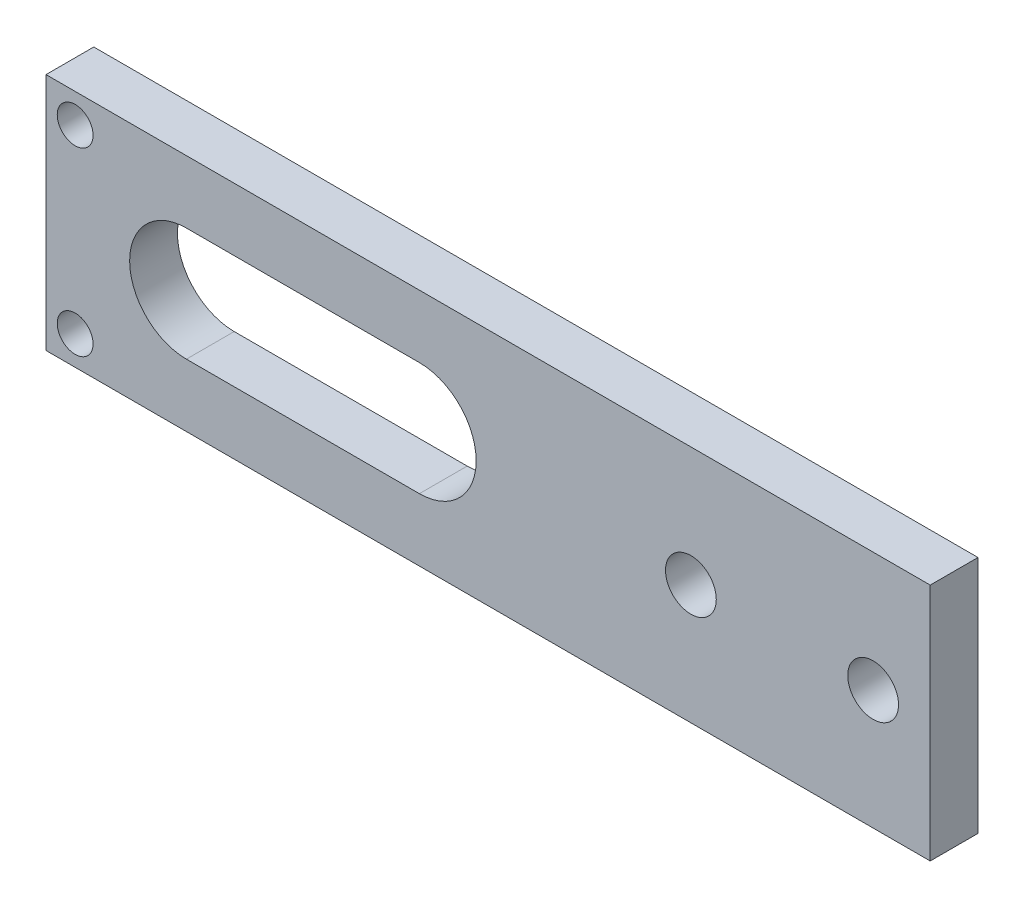
ISO-10303-21;
HEADER;
FILE_DESCRIPTION(('STEP AP214'),'2;1');
FILE_NAME('part.step','',(''),(''),'','','');
FILE_SCHEMA(('AUTOMOTIVE_DESIGN { 1 0 10303 214 1 1 1 1 }'));
ENDSEC;
DATA;
#1=APPLICATION_CONTEXT('core data for automotive mechanical design processes');
#2=APPLICATION_PROTOCOL_DEFINITION('international standard','automotive_design',2000,#1);
#3=PRODUCT_CONTEXT('',#1,'mechanical');
#4=PRODUCT('Part','Part','',(#3));
#5=PRODUCT_RELATED_PRODUCT_CATEGORY('part','',(#4));
#6=PRODUCT_DEFINITION_FORMATION('','',#4);
#7=PRODUCT_DEFINITION_CONTEXT('part definition',#1,'design');
#8=PRODUCT_DEFINITION('design','',#6,#7);
#9=PRODUCT_DEFINITION_SHAPE('','',#8);
#10=(LENGTH_UNIT() NAMED_UNIT(*) SI_UNIT(.MILLI.,.METRE.));
#11=(NAMED_UNIT(*) PLANE_ANGLE_UNIT() SI_UNIT($,.RADIAN.));
#12=(NAMED_UNIT(*) SI_UNIT($,.STERADIAN.) SOLID_ANGLE_UNIT());
#13=UNCERTAINTY_MEASURE_WITH_UNIT(LENGTH_MEASURE(1.E-05),#10,'distance_accuracy_value','');
#14=(GEOMETRIC_REPRESENTATION_CONTEXT(3) GLOBAL_UNCERTAINTY_ASSIGNED_CONTEXT((#13)) GLOBAL_UNIT_ASSIGNED_CONTEXT((#10,
#11,#12)) REPRESENTATION_CONTEXT('',''));
#15=CARTESIAN_POINT('',(0.,0.,0.));
#16=DIRECTION('',(0.,0.,1.));
#17=DIRECTION('',(1.,0.,0.));
#18=AXIS2_PLACEMENT_3D('',#15,#16,#17);
#19=CARTESIAN_POINT('',(0.,0.,4.));
#20=DIRECTION('',(0.,0.,1.));
#21=DIRECTION('',(1.,0.,0.));
#22=AXIS2_PLACEMENT_3D('',#19,#20,#21);
#23=PLANE('',#22);
#24=CARTESIAN_POINT('',(-34.5593059383902,-7.55930593839024,4.));
#25=DIRECTION('',(0.,0.,1.));
#26=DIRECTION('',(1.,0.,0.));
#27=AXIS2_PLACEMENT_3D('',#24,#25,#26);
#28=CIRCLE('',#27,1.5);
#29=CARTESIAN_POINT('',(-33.0593059383902,-7.55930593839024,4.));
#30=VERTEX_POINT('',#29);
#31=EDGE_CURVE('E130',#30,#30,#28,.T.);
#32=ORIENTED_EDGE('',*,*,#31,.F.);
#33=EDGE_LOOP('',(#32));
#34=FACE_BOUND('',#33,.T.);
#35=CARTESIAN_POINT('',(32.2218543046358,0.,4.));
#36=DIRECTION('',(0.,0.,1.));
#37=DIRECTION('',(1.,0.,0.));
#38=AXIS2_PLACEMENT_3D('',#35,#36,#37);
#39=CIRCLE('',#38,2.125);
#40=CARTESIAN_POINT('',(34.3468543046358,0.,4.));
#41=VERTEX_POINT('',#40);
#42=EDGE_CURVE('E146',#41,#41,#39,.T.);
#43=ORIENTED_EDGE('',*,*,#42,.F.);
#44=EDGE_LOOP('',(#43));
#45=FACE_BOUND('',#44,.T.);
#46=DIRECTION('',(0.,1.,0.));
#47=VECTOR('',#46,1.);
#48=CARTESIAN_POINT('',(37.,10.,4.));
#49=LINE('',#48,#47);
#50=CARTESIAN_POINT('',(37.,-9.99999999999999,4.));
#51=VERTEX_POINT('',#50);
#52=CARTESIAN_POINT('',(37.,10.,4.));
#53=VERTEX_POINT('',#52);
#54=EDGE_CURVE('E152',#51,#53,#49,.T.);
#55=ORIENTED_EDGE('',*,*,#54,.T.);
#56=DIRECTION('',(-1.,0.,0.));
#57=VECTOR('',#56,1.);
#58=CARTESIAN_POINT('',(-37.,10.,4.));
#59=LINE('',#58,#57);
#60=CARTESIAN_POINT('',(-37.,10.,4.));
#61=VERTEX_POINT('',#60);
#62=EDGE_CURVE('E155',#53,#61,#59,.T.);
#63=ORIENTED_EDGE('',*,*,#62,.T.);
#64=DIRECTION('',(0.,-1.,0.));
#65=VECTOR('',#64,1.);
#66=CARTESIAN_POINT('',(-37.,10.,4.));
#67=LINE('',#66,#65);
#68=CARTESIAN_POINT('',(-37.,-9.99999999999999,4.));
#69=VERTEX_POINT('',#68);
#70=EDGE_CURVE('E158',#61,#69,#67,.T.);
#71=ORIENTED_EDGE('',*,*,#70,.T.);
#72=DIRECTION('',(1.,0.,0.));
#73=VECTOR('',#72,1.);
#74=CARTESIAN_POINT('',(-37.,-9.99999999999999,4.));
#75=LINE('',#74,#73);
#76=EDGE_CURVE('E160',#69,#51,#75,.T.);
#77=ORIENTED_EDGE('',*,*,#76,.T.);
#78=EDGE_LOOP('',(#55,#63,#71,#77));
#79=FACE_BOUND('',#78,.T.);
#80=CARTESIAN_POINT('',(16.9718543046358,-1.06490180834716E-13,4.));
#81=DIRECTION('',(0.,0.,1.));
#82=DIRECTION('',(1.,0.,0.));
#83=AXIS2_PLACEMENT_3D('',#80,#81,#82);
#84=CIRCLE('',#83,2.125);
#85=CARTESIAN_POINT('',(19.0968543046358,-1.06490180834716E-13,4.));
#86=VERTEX_POINT('',#85);
#87=EDGE_CURVE('E140',#86,#86,#84,.T.);
#88=ORIENTED_EDGE('',*,*,#87,.F.);
#89=EDGE_LOOP('',(#88));
#90=FACE_BOUND('',#89,.T.);
#91=DIRECTION('',(1.,0.,0.));
#92=VECTOR('',#91,1.);
#93=CARTESIAN_POINT('',(-25.25,-4.75,4.));
#94=LINE('',#93,#92);
#95=CARTESIAN_POINT('',(-25.25,-4.75,4.));
#96=VERTEX_POINT('',#95);
#97=CARTESIAN_POINT('',(-5.74999999999998,-4.75,4.));
#98=VERTEX_POINT('',#97);
#99=EDGE_CURVE('E109',#96,#98,#94,.T.);
#100=ORIENTED_EDGE('',*,*,#99,.F.);
#101=CARTESIAN_POINT('',(-25.25,0.,4.));
#102=DIRECTION('',(0.,0.,1.));
#103=DIRECTION('',(1.,0.,0.));
#104=AXIS2_PLACEMENT_3D('',#101,#102,#103);
#105=CIRCLE('',#104,4.75);
#106=CARTESIAN_POINT('',(-25.25,4.75,4.));
#107=VERTEX_POINT('',#106);
#108=EDGE_CURVE('E101',#107,#96,#105,.T.);
#109=ORIENTED_EDGE('',*,*,#108,.F.);
#110=DIRECTION('',(-1.,0.,0.));
#111=VECTOR('',#110,1.);
#112=CARTESIAN_POINT('',(-25.25,4.75,4.));
#113=LINE('',#112,#111);
#114=CARTESIAN_POINT('',(-5.74999999999998,4.75,4.));
#115=VERTEX_POINT('',#114);
#116=EDGE_CURVE('E124',#115,#107,#113,.T.);
#117=ORIENTED_EDGE('',*,*,#116,.F.);
#118=CARTESIAN_POINT('',(-5.74999999999998,0.,4.));
#119=DIRECTION('',(0.,0.,1.));
#120=DIRECTION('',(1.,0.,0.));
#121=AXIS2_PLACEMENT_3D('',#118,#119,#120);
#122=CIRCLE('',#121,4.75);
#123=EDGE_CURVE('E122',#98,#115,#122,.T.);
#124=ORIENTED_EDGE('',*,*,#123,.F.);
#125=EDGE_LOOP('',(#100,#109,#117,#124));
#126=FACE_BOUND('',#125,.T.);
#127=CARTESIAN_POINT('',(-34.5593059383902,7.55930593839024,4.));
#128=DIRECTION('',(0.,0.,1.));
#129=DIRECTION('',(-1.,0.,0.));
#130=AXIS2_PLACEMENT_3D('',#127,#128,#129);
#131=CIRCLE('',#130,1.5);
#132=CARTESIAN_POINT('',(-36.0593059383902,7.55930593839024,4.));
#133=VERTEX_POINT('',#132);
#134=EDGE_CURVE('E258',#133,#133,#131,.T.);
#135=ORIENTED_EDGE('',*,*,#134,.F.);
#136=EDGE_LOOP('',(#135));
#137=FACE_BOUND('',#136,.T.);
#138=ADVANCED_FACE('F36',(#34,#45,#79,#90,#126,#137),#23,.T.);
#139=CARTESIAN_POINT('',(0.,0.,0.));
#140=DIRECTION('',(0.,0.,1.));
#141=DIRECTION('',(1.,0.,0.));
#142=AXIS2_PLACEMENT_3D('',#139,#140,#141);
#143=PLANE('',#142);
#144=CARTESIAN_POINT('',(16.9718543046358,-1.06490180834716E-13,0.));
#145=DIRECTION('',(0.,0.,1.));
#146=DIRECTION('',(1.,0.,0.));
#147=AXIS2_PLACEMENT_3D('',#144,#145,#146);
#148=CIRCLE('',#147,2.125);
#149=CARTESIAN_POINT('',(19.0968543046358,-1.06490180834716E-13,0.));
#150=VERTEX_POINT('',#149);
#151=EDGE_CURVE('E117',#150,#150,#148,.T.);
#152=ORIENTED_EDGE('',*,*,#151,.T.);
#153=EDGE_LOOP('',(#152));
#154=FACE_BOUND('',#153,.T.);
#155=CARTESIAN_POINT('',(32.2218543046358,0.,0.));
#156=DIRECTION('',(0.,0.,1.));
#157=DIRECTION('',(1.,0.,0.));
#158=AXIS2_PLACEMENT_3D('',#155,#156,#157);
#159=CIRCLE('',#158,2.125);
#160=CARTESIAN_POINT('',(34.3468543046358,0.,0.));
#161=VERTEX_POINT('',#160);
#162=EDGE_CURVE('E143',#161,#161,#159,.T.);
#163=ORIENTED_EDGE('',*,*,#162,.T.);
#164=EDGE_LOOP('',(#163));
#165=FACE_BOUND('',#164,.T.);
#166=DIRECTION('',(0.,1.,0.));
#167=VECTOR('',#166,1.);
#168=CARTESIAN_POINT('',(37.,10.,0.));
#169=LINE('',#168,#167);
#170=CARTESIAN_POINT('',(37.,-9.99999999999999,0.));
#171=VERTEX_POINT('',#170);
#172=CARTESIAN_POINT('',(37.,10.,0.));
#173=VERTEX_POINT('',#172);
#174=EDGE_CURVE('E149',#171,#173,#169,.T.);
#175=ORIENTED_EDGE('',*,*,#174,.F.);
#176=DIRECTION('',(1.,0.,0.));
#177=VECTOR('',#176,1.);
#178=CARTESIAN_POINT('',(-37.,-9.99999999999999,0.));
#179=LINE('',#178,#177);
#180=CARTESIAN_POINT('',(-37.,-9.99999999999999,0.));
#181=VERTEX_POINT('',#180);
#182=EDGE_CURVE('E156',#181,#171,#179,.T.);
#183=ORIENTED_EDGE('',*,*,#182,.F.);
#184=DIRECTION('',(0.,-1.,0.));
#185=VECTOR('',#184,1.);
#186=CARTESIAN_POINT('',(-37.,10.,0.));
#187=LINE('',#186,#185);
#188=CARTESIAN_POINT('',(-37.,10.,0.));
#189=VERTEX_POINT('',#188);
#190=EDGE_CURVE('E167',#189,#181,#187,.T.);
#191=ORIENTED_EDGE('',*,*,#190,.F.);
#192=DIRECTION('',(-1.,0.,0.));
#193=VECTOR('',#192,1.);
#194=CARTESIAN_POINT('',(-37.,10.,0.));
#195=LINE('',#194,#193);
#196=EDGE_CURVE('E165',#173,#189,#195,.T.);
#197=ORIENTED_EDGE('',*,*,#196,.F.);
#198=EDGE_LOOP('',(#175,#183,#191,#197));
#199=FACE_BOUND('',#198,.T.);
#200=CARTESIAN_POINT('',(-25.25,0.,0.));
#201=DIRECTION('',(0.,0.,1.));
#202=DIRECTION('',(1.,0.,0.));
#203=AXIS2_PLACEMENT_3D('',#200,#201,#202);
#204=CIRCLE('',#203,4.75);
#205=CARTESIAN_POINT('',(-25.25,4.75,0.));
#206=VERTEX_POINT('',#205);
#207=CARTESIAN_POINT('',(-25.25,-4.75,0.));
#208=VERTEX_POINT('',#207);
#209=EDGE_CURVE('E59',#206,#208,#204,.T.);
#210=ORIENTED_EDGE('',*,*,#209,.T.);
#211=DIRECTION('',(1.,0.,0.));
#212=VECTOR('',#211,1.);
#213=CARTESIAN_POINT('',(-25.25,-4.75,0.));
#214=LINE('',#213,#212);
#215=CARTESIAN_POINT('',(-5.74999999999998,-4.75,0.));
#216=VERTEX_POINT('',#215);
#217=EDGE_CURVE('E116',#208,#216,#214,.T.);
#218=ORIENTED_EDGE('',*,*,#217,.T.);
#219=CARTESIAN_POINT('',(-5.74999999999998,0.,0.));
#220=DIRECTION('',(0.,0.,1.));
#221=DIRECTION('',(1.,0.,0.));
#222=AXIS2_PLACEMENT_3D('',#219,#220,#221);
#223=CIRCLE('',#222,4.75);
#224=CARTESIAN_POINT('',(-5.74999999999998,4.75,0.));
#225=VERTEX_POINT('',#224);
#226=EDGE_CURVE('E132',#216,#225,#223,.T.);
#227=ORIENTED_EDGE('',*,*,#226,.T.);
#228=DIRECTION('',(-1.,0.,0.));
#229=VECTOR('',#228,1.);
#230=CARTESIAN_POINT('',(-25.25,4.75,0.));
#231=LINE('',#230,#229);
#232=EDGE_CURVE('E110',#225,#206,#231,.T.);
#233=ORIENTED_EDGE('',*,*,#232,.T.);
#234=EDGE_LOOP('',(#210,#218,#227,#233));
#235=FACE_BOUND('',#234,.T.);
#236=CARTESIAN_POINT('',(-34.5593059383902,-7.55930593839024,0.));
#237=DIRECTION('',(0.,0.,1.));
#238=DIRECTION('',(1.,0.,0.));
#239=AXIS2_PLACEMENT_3D('',#236,#237,#238);
#240=CIRCLE('',#239,1.5);
#241=CARTESIAN_POINT('',(-33.0593059383902,-7.55930593839024,0.));
#242=VERTEX_POINT('',#241);
#243=EDGE_CURVE('E264',#242,#242,#240,.T.);
#244=ORIENTED_EDGE('',*,*,#243,.T.);
#245=EDGE_LOOP('',(#244));
#246=FACE_BOUND('',#245,.T.);
#247=CARTESIAN_POINT('',(-34.5593059383902,7.55930593839024,0.));
#248=DIRECTION('',(0.,0.,1.));
#249=DIRECTION('',(-1.,0.,0.));
#250=AXIS2_PLACEMENT_3D('',#247,#248,#249);
#251=CIRCLE('',#250,1.5);
#252=CARTESIAN_POINT('',(-36.0593059383902,7.55930593839024,0.));
#253=VERTEX_POINT('',#252);
#254=EDGE_CURVE('E261',#253,#253,#251,.T.);
#255=ORIENTED_EDGE('',*,*,#254,.T.);
#256=EDGE_LOOP('',(#255));
#257=FACE_BOUND('',#256,.T.);
#258=ADVANCED_FACE('F185',(#154,#165,#199,#235,#246,#257),#143,.F.);
#259=CARTESIAN_POINT('',(37.,10.,4.));
#260=DIRECTION('',(-1.,0.,0.));
#261=DIRECTION('',(0.,0.,1.));
#262=AXIS2_PLACEMENT_3D('',#259,#260,#261);
#263=PLANE('',#262);
#264=ORIENTED_EDGE('',*,*,#174,.T.);
#265=DIRECTION('',(0.,0.,-1.));
#266=VECTOR('',#265,1.);
#267=CARTESIAN_POINT('',(37.,10.,4.));
#268=LINE('',#267,#266);
#269=EDGE_CURVE('E11',#53,#173,#268,.T.);
#270=ORIENTED_EDGE('',*,*,#269,.F.);
#271=ORIENTED_EDGE('',*,*,#54,.F.);
#272=DIRECTION('',(0.,0.,-1.));
#273=VECTOR('',#272,1.);
#274=CARTESIAN_POINT('',(37.,-9.99999999999999,4.));
#275=LINE('',#274,#273);
#276=EDGE_CURVE('E162',#51,#171,#275,.T.);
#277=ORIENTED_EDGE('',*,*,#276,.T.);
#278=EDGE_LOOP('',(#264,#270,#271,#277));
#279=FACE_BOUND('',#278,.T.);
#280=ADVANCED_FACE('F38',(#279),#263,.F.);
#281=CARTESIAN_POINT('',(-37.,10.,4.));
#282=DIRECTION('',(0.,-1.,0.));
#283=DIRECTION('',(0.,0.,-1.));
#284=AXIS2_PLACEMENT_3D('',#281,#282,#283);
#285=PLANE('',#284);
#286=ORIENTED_EDGE('',*,*,#196,.T.);
#287=DIRECTION('',(0.,0.,-1.));
#288=VECTOR('',#287,1.);
#289=CARTESIAN_POINT('',(-37.,10.,4.));
#290=LINE('',#289,#288);
#291=EDGE_CURVE('E44',#61,#189,#290,.T.);
#292=ORIENTED_EDGE('',*,*,#291,.F.);
#293=ORIENTED_EDGE('',*,*,#62,.F.);
#294=ORIENTED_EDGE('',*,*,#269,.T.);
#295=EDGE_LOOP('',(#286,#292,#293,#294));
#296=FACE_BOUND('',#295,.T.);
#297=ADVANCED_FACE('F196',(#296),#285,.F.);
#298=CARTESIAN_POINT('',(-37.,10.,4.));
#299=DIRECTION('',(1.,0.,0.));
#300=DIRECTION('',(0.,1.,0.));
#301=AXIS2_PLACEMENT_3D('',#298,#299,#300);
#302=PLANE('',#301);
#303=ORIENTED_EDGE('',*,*,#190,.T.);
#304=DIRECTION('',(0.,0.,-1.));
#305=VECTOR('',#304,1.);
#306=CARTESIAN_POINT('',(-37.,-9.99999999999999,4.));
#307=LINE('',#306,#305);
#308=EDGE_CURVE('E172',#69,#181,#307,.T.);
#309=ORIENTED_EDGE('',*,*,#308,.F.);
#310=ORIENTED_EDGE('',*,*,#70,.F.);
#311=ORIENTED_EDGE('',*,*,#291,.T.);
#312=EDGE_LOOP('',(#303,#309,#310,#311));
#313=FACE_BOUND('',#312,.T.);
#314=ADVANCED_FACE('F179',(#313),#302,.F.);
#315=CARTESIAN_POINT('',(-37.,-9.99999999999999,4.));
#316=DIRECTION('',(0.,1.,0.));
#317=DIRECTION('',(0.,0.,1.));
#318=AXIS2_PLACEMENT_3D('',#315,#316,#317);
#319=PLANE('',#318);
#320=ORIENTED_EDGE('',*,*,#182,.T.);
#321=ORIENTED_EDGE('',*,*,#276,.F.);
#322=ORIENTED_EDGE('',*,*,#76,.F.);
#323=ORIENTED_EDGE('',*,*,#308,.T.);
#324=EDGE_LOOP('',(#320,#321,#322,#323));
#325=FACE_BOUND('',#324,.T.);
#326=ADVANCED_FACE('F189',(#325),#319,.F.);
#327=CARTESIAN_POINT('',(32.2218543046358,0.,4.));
#328=DIRECTION('',(0.,0.,-1.));
#329=DIRECTION('',(-1.,0.,0.));
#330=AXIS2_PLACEMENT_3D('',#327,#328,#329);
#331=CYLINDRICAL_SURFACE('',#330,2.125);
#332=ORIENTED_EDGE('',*,*,#42,.T.);
#333=EDGE_LOOP('',(#332));
#334=FACE_BOUND('',#333,.T.);
#335=ORIENTED_EDGE('',*,*,#162,.F.);
#336=EDGE_LOOP('',(#335));
#337=FACE_BOUND('',#336,.T.);
#338=ADVANCED_FACE('F214',(#334,#337),#331,.F.);
#339=CARTESIAN_POINT('',(16.9718543046358,-1.06490180834716E-13,4.));
#340=DIRECTION('',(0.,0.,-1.));
#341=DIRECTION('',(-1.,0.,0.));
#342=AXIS2_PLACEMENT_3D('',#339,#340,#341);
#343=CYLINDRICAL_SURFACE('',#342,2.125);
#344=ORIENTED_EDGE('',*,*,#87,.T.);
#345=EDGE_LOOP('',(#344));
#346=FACE_BOUND('',#345,.T.);
#347=ORIENTED_EDGE('',*,*,#151,.F.);
#348=EDGE_LOOP('',(#347));
#349=FACE_BOUND('',#348,.T.);
#350=ADVANCED_FACE('F221',(#346,#349),#343,.F.);
#351=CARTESIAN_POINT('',(-25.25,0.,4.));
#352=DIRECTION('',(0.,0.,-1.));
#353=DIRECTION('',(-1.,0.,0.));
#354=AXIS2_PLACEMENT_3D('',#351,#352,#353);
#355=CYLINDRICAL_SURFACE('',#354,4.75);
#356=ORIENTED_EDGE('',*,*,#209,.F.);
#357=DIRECTION('',(0.,0.,-1.));
#358=VECTOR('',#357,1.);
#359=CARTESIAN_POINT('',(-25.25,4.75,4.));
#360=LINE('',#359,#358);
#361=EDGE_CURVE('E105',#107,#206,#360,.T.);
#362=ORIENTED_EDGE('',*,*,#361,.F.);
#363=ORIENTED_EDGE('',*,*,#108,.T.);
#364=DIRECTION('',(0.,0.,-1.));
#365=VECTOR('',#364,1.);
#366=CARTESIAN_POINT('',(-25.25,-4.75,4.));
#367=LINE('',#366,#365);
#368=EDGE_CURVE('E104',#96,#208,#367,.T.);
#369=ORIENTED_EDGE('',*,*,#368,.T.);
#370=EDGE_LOOP('',(#356,#362,#363,#369));
#371=FACE_BOUND('',#370,.T.);
#372=ADVANCED_FACE('F103',(#371),#355,.F.);
#373=CARTESIAN_POINT('',(-25.25,-4.75,4.));
#374=DIRECTION('',(0.,1.,0.));
#375=DIRECTION('',(0.,0.,1.));
#376=AXIS2_PLACEMENT_3D('',#373,#374,#375);
#377=PLANE('',#376);
#378=ORIENTED_EDGE('',*,*,#217,.F.);
#379=ORIENTED_EDGE('',*,*,#368,.F.);
#380=ORIENTED_EDGE('',*,*,#99,.T.);
#381=DIRECTION('',(0.,0.,-1.));
#382=VECTOR('',#381,1.);
#383=CARTESIAN_POINT('',(-5.74999999999998,-4.75,4.));
#384=LINE('',#383,#382);
#385=EDGE_CURVE('E118',#98,#216,#384,.T.);
#386=ORIENTED_EDGE('',*,*,#385,.T.);
#387=EDGE_LOOP('',(#378,#379,#380,#386));
#388=FACE_BOUND('',#387,.T.);
#389=ADVANCED_FACE('F113',(#388),#377,.T.);
#390=CARTESIAN_POINT('',(-5.74999999999998,0.,4.));
#391=DIRECTION('',(0.,0.,-1.));
#392=DIRECTION('',(-1.,0.,0.));
#393=AXIS2_PLACEMENT_3D('',#390,#391,#392);
#394=CYLINDRICAL_SURFACE('',#393,4.75);
#395=ORIENTED_EDGE('',*,*,#226,.F.);
#396=ORIENTED_EDGE('',*,*,#385,.F.);
#397=ORIENTED_EDGE('',*,*,#123,.T.);
#398=DIRECTION('',(0.,0.,-1.));
#399=VECTOR('',#398,1.);
#400=CARTESIAN_POINT('',(-5.74999999999998,4.75,4.));
#401=LINE('',#400,#399);
#402=EDGE_CURVE('E51',#115,#225,#401,.T.);
#403=ORIENTED_EDGE('',*,*,#402,.T.);
#404=EDGE_LOOP('',(#395,#396,#397,#403));
#405=FACE_BOUND('',#404,.T.);
#406=ADVANCED_FACE('F239',(#405),#394,.F.);
#407=CARTESIAN_POINT('',(-25.25,4.75,4.));
#408=DIRECTION('',(0.,-1.,0.));
#409=DIRECTION('',(0.,0.,-1.));
#410=AXIS2_PLACEMENT_3D('',#407,#408,#409);
#411=PLANE('',#410);
#412=ORIENTED_EDGE('',*,*,#232,.F.);
#413=ORIENTED_EDGE('',*,*,#402,.F.);
#414=ORIENTED_EDGE('',*,*,#116,.T.);
#415=ORIENTED_EDGE('',*,*,#361,.T.);
#416=EDGE_LOOP('',(#412,#413,#414,#415));
#417=FACE_BOUND('',#416,.T.);
#418=ADVANCED_FACE('F242',(#417),#411,.T.);
#419=CARTESIAN_POINT('',(-34.5593059383902,-7.55930593839024,4.));
#420=DIRECTION('',(0.,0.,-1.));
#421=DIRECTION('',(-1.,0.,0.));
#422=AXIS2_PLACEMENT_3D('',#419,#420,#421);
#423=CYLINDRICAL_SURFACE('',#422,1.5);
#424=ORIENTED_EDGE('',*,*,#31,.T.);
#425=EDGE_LOOP('',(#424));
#426=FACE_BOUND('',#425,.T.);
#427=ORIENTED_EDGE('',*,*,#243,.F.);
#428=EDGE_LOOP('',(#427));
#429=FACE_BOUND('',#428,.T.);
#430=ADVANCED_FACE('F246',(#426,#429),#423,.F.);
#431=CARTESIAN_POINT('',(-34.5593059383902,7.55930593839024,4.));
#432=DIRECTION('',(0.,0.,-1.));
#433=DIRECTION('',(-1.,0.,0.));
#434=AXIS2_PLACEMENT_3D('',#431,#432,#433);
#435=CYLINDRICAL_SURFACE('',#434,1.5);
#436=ORIENTED_EDGE('',*,*,#134,.T.);
#437=EDGE_LOOP('',(#436));
#438=FACE_BOUND('',#437,.T.);
#439=ORIENTED_EDGE('',*,*,#254,.F.);
#440=EDGE_LOOP('',(#439));
#441=FACE_BOUND('',#440,.T.);
#442=ADVANCED_FACE('F249',(#438,#441),#435,.F.);
#443=CLOSED_SHELL('',(#138,#258,#280,#297,#314,#326,#338,#350,#372,#389,#406,#418,#430,#442));
#444=MANIFOLD_SOLID_BREP('B2',#443);
#445=ADVANCED_BREP_SHAPE_REPRESENTATION('',(#18,#444),#14);
#446=SHAPE_DEFINITION_REPRESENTATION(#9,#445);
ENDSEC;
END-ISO-10303-21;
